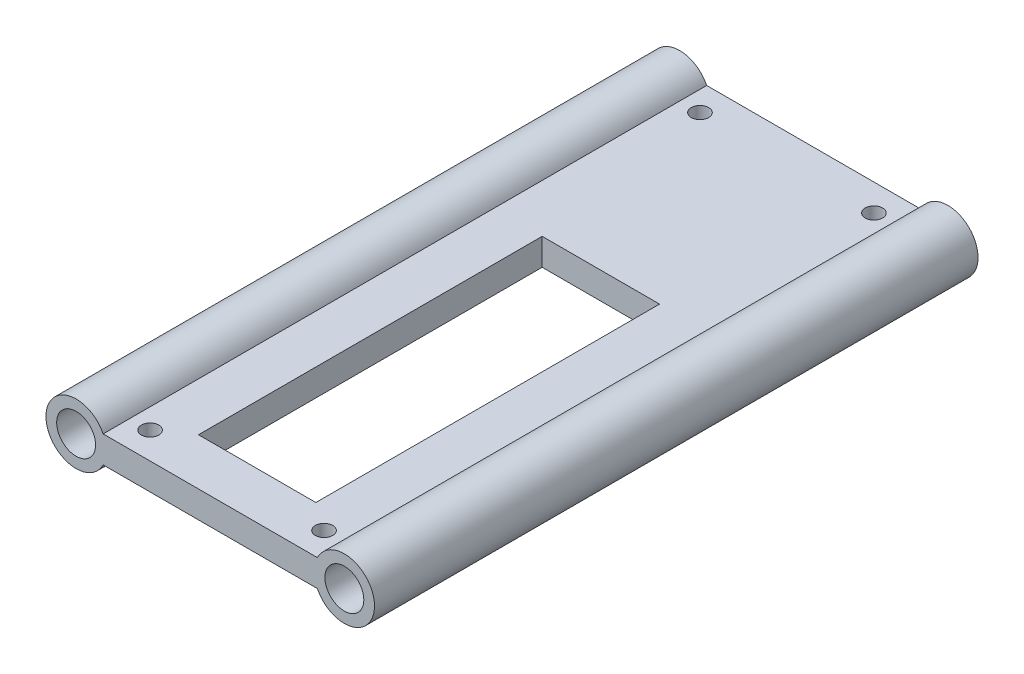
ISO-10303-21;
HEADER;
FILE_DESCRIPTION(('STEP AP214'),'2;1');
FILE_NAME('part.step','',(''),(''),'','','');
FILE_SCHEMA(('AUTOMOTIVE_DESIGN { 1 0 10303 214 1 1 1 1 }'));
ENDSEC;
DATA;
#1=APPLICATION_CONTEXT('core data for automotive mechanical design processes');
#2=APPLICATION_PROTOCOL_DEFINITION('international standard','automotive_design',2000,#1);
#3=PRODUCT_CONTEXT('',#1,'mechanical');
#4=PRODUCT('Part','Part','',(#3));
#5=PRODUCT_RELATED_PRODUCT_CATEGORY('part','',(#4));
#6=PRODUCT_DEFINITION_FORMATION('','',#4);
#7=PRODUCT_DEFINITION_CONTEXT('part definition',#1,'design');
#8=PRODUCT_DEFINITION('design','',#6,#7);
#9=PRODUCT_DEFINITION_SHAPE('','',#8);
#10=(LENGTH_UNIT() NAMED_UNIT(*) SI_UNIT(.MILLI.,.METRE.));
#11=(NAMED_UNIT(*) PLANE_ANGLE_UNIT() SI_UNIT($,.RADIAN.));
#12=(NAMED_UNIT(*) SI_UNIT($,.STERADIAN.) SOLID_ANGLE_UNIT());
#13=UNCERTAINTY_MEASURE_WITH_UNIT(LENGTH_MEASURE(1.E-05),#10,'distance_accuracy_value','');
#14=(GEOMETRIC_REPRESENTATION_CONTEXT(3) GLOBAL_UNCERTAINTY_ASSIGNED_CONTEXT((#13)) GLOBAL_UNIT_ASSIGNED_CONTEXT((#10,
#11,#12)) REPRESENTATION_CONTEXT('',''));
#15=CARTESIAN_POINT('',(0.,0.,0.));
#16=DIRECTION('',(0.,0.,1.));
#17=DIRECTION('',(1.,0.,0.));
#18=AXIS2_PLACEMENT_3D('',#15,#16,#17);
#19=CARTESIAN_POINT('',(0.,-2.54,-114.3));
#20=DIRECTION('',(0.,-1.,0.));
#21=DIRECTION('',(0.,0.,-1.));
#22=AXIS2_PLACEMENT_3D('',#19,#20,#21);
#23=PLANE('',#22);
#24=CARTESIAN_POINT('',(16.4704663298304,-2.54,-109.22));
#25=DIRECTION('',(0.,-1.,0.));
#26=DIRECTION('',(0.,0.,-1.));
#27=AXIS2_PLACEMENT_3D('',#24,#25,#26);
#28=CIRCLE('',#27,1.651);
#29=CARTESIAN_POINT('',(16.4704663298304,-2.54,-110.871));
#30=VERTEX_POINT('',#29);
#31=EDGE_CURVE('E182',#30,#30,#28,.T.);
#32=ORIENTED_EDGE('',*,*,#31,.F.);
#33=EDGE_LOOP('',(#32));
#34=FACE_BOUND('',#33,.T.);
#35=CARTESIAN_POINT('',(-16.4704663298304,-2.54,-5.08));
#36=DIRECTION('',(0.,-1.,0.));
#37=DIRECTION('',(0.,0.,-1.));
#38=AXIS2_PLACEMENT_3D('',#35,#36,#37);
#39=CIRCLE('',#38,1.651);
#40=CARTESIAN_POINT('',(-16.4704663298304,-2.54,-6.731));
#41=VERTEX_POINT('',#40);
#42=EDGE_CURVE('E179',#41,#41,#39,.T.);
#43=ORIENTED_EDGE('',*,*,#42,.F.);
#44=EDGE_LOOP('',(#43));
#45=FACE_BOUND('',#44,.T.);
#46=CARTESIAN_POINT('',(16.4704663298304,-2.54,-5.08));
#47=DIRECTION('',(0.,-1.,0.));
#48=DIRECTION('',(0.,0.,-1.));
#49=AXIS2_PLACEMENT_3D('',#46,#47,#48);
#50=CIRCLE('',#49,1.651);
#51=CARTESIAN_POINT('',(16.4704663298304,-2.54,-6.731));
#52=VERTEX_POINT('',#51);
#53=EDGE_CURVE('E176',#52,#52,#50,.T.);
#54=ORIENTED_EDGE('',*,*,#53,.F.);
#55=EDGE_LOOP('',(#54));
#56=FACE_BOUND('',#55,.T.);
#57=DIRECTION('',(0.,0.,1.));
#58=VECTOR('',#57,1.);
#59=CARTESIAN_POINT('',(11.1125,-2.54,-114.3));
#60=LINE('',#59,#58);
#61=CARTESIAN_POINT('',(11.1125,-2.54,-73.9775));
#62=VERTEX_POINT('',#61);
#63=CARTESIAN_POINT('',(11.1125,-2.54,-8.88999999999999));
#64=VERTEX_POINT('',#63);
#65=EDGE_CURVE('E131',#62,#64,#60,.T.);
#66=ORIENTED_EDGE('',*,*,#65,.F.);
#67=DIRECTION('',(1.,0.,0.));
#68=VECTOR('',#67,1.);
#69=CARTESIAN_POINT('',(0.,-2.54,-73.9775));
#70=LINE('',#69,#68);
#71=CARTESIAN_POINT('',(-11.1125,-2.54,-73.9775));
#72=VERTEX_POINT('',#71);
#73=EDGE_CURVE('E169',#72,#62,#70,.T.);
#74=ORIENTED_EDGE('',*,*,#73,.F.);
#75=DIRECTION('',(0.,0.,-1.));
#76=VECTOR('',#75,1.);
#77=CARTESIAN_POINT('',(-11.1125,-2.54,-114.3));
#78=LINE('',#77,#76);
#79=CARTESIAN_POINT('',(-11.1125,-2.54,-8.89));
#80=VERTEX_POINT('',#79);
#81=EDGE_CURVE('E171',#80,#72,#78,.T.);
#82=ORIENTED_EDGE('',*,*,#81,.F.);
#83=DIRECTION('',(-1.,0.,0.));
#84=VECTOR('',#83,1.);
#85=CARTESIAN_POINT('',(0.,-2.54,-8.89));
#86=LINE('',#85,#84);
#87=EDGE_CURVE('E173',#64,#80,#86,.T.);
#88=ORIENTED_EDGE('',*,*,#87,.F.);
#89=EDGE_LOOP('',(#66,#74,#82,#88));
#90=FACE_BOUND('',#89,.T.);
#91=CARTESIAN_POINT('',(-16.4704663298304,-2.54,-109.22));
#92=DIRECTION('',(0.,-1.,0.));
#93=DIRECTION('',(0.,0.,-1.));
#94=AXIS2_PLACEMENT_3D('',#91,#92,#93);
#95=CIRCLE('',#94,1.651);
#96=CARTESIAN_POINT('',(-16.4704663298304,-2.54,-110.871));
#97=VERTEX_POINT('',#96);
#98=EDGE_CURVE('E166',#97,#97,#95,.T.);
#99=ORIENTED_EDGE('',*,*,#98,.F.);
#100=EDGE_LOOP('',(#99));
#101=FACE_BOUND('',#100,.T.);
#102=DIRECTION('',(1.,0.,0.));
#103=VECTOR('',#102,1.);
#104=CARTESIAN_POINT('',(0.,-2.54,0.));
#105=LINE('',#104,#103);
#106=CARTESIAN_POINT('',(-20.2804663298304,-2.54,0.));
#107=VERTEX_POINT('',#106);
#108=CARTESIAN_POINT('',(20.2804663298304,-2.54,0.));
#109=VERTEX_POINT('',#108);
#110=EDGE_CURVE('E202',#107,#109,#105,.T.);
#111=ORIENTED_EDGE('',*,*,#110,.F.);
#112=DIRECTION('',(0.,0.,1.));
#113=VECTOR('',#112,1.);
#114=CARTESIAN_POINT('',(-20.2804663298304,-2.54,-114.3));
#115=LINE('',#114,#113);
#116=CARTESIAN_POINT('',(-20.2804663298304,-2.54,-114.3));
#117=VERTEX_POINT('',#116);
#118=EDGE_CURVE('E12',#117,#107,#115,.T.);
#119=ORIENTED_EDGE('',*,*,#118,.F.);
#120=DIRECTION('',(1.,0.,0.));
#121=VECTOR('',#120,1.);
#122=CARTESIAN_POINT('',(0.,-2.54,-114.3));
#123=LINE('',#122,#121);
#124=CARTESIAN_POINT('',(20.2804663298304,-2.54,-114.3));
#125=VERTEX_POINT('',#124);
#126=EDGE_CURVE('E189',#117,#125,#123,.T.);
#127=ORIENTED_EDGE('',*,*,#126,.T.);
#128=DIRECTION('',(0.,0.,1.));
#129=VECTOR('',#128,1.);
#130=CARTESIAN_POINT('',(20.2804663298304,-2.54,-114.3));
#131=LINE('',#130,#129);
#132=EDGE_CURVE('E198',#125,#109,#131,.T.);
#133=ORIENTED_EDGE('',*,*,#132,.T.);
#134=EDGE_LOOP('',(#111,#119,#127,#133));
#135=FACE_BOUND('',#134,.T.);
#136=ADVANCED_FACE('F62',(#34,#45,#56,#90,#101,#135),#23,.T.);
#137=CARTESIAN_POINT('',(0.,2.54,-114.3));
#138=DIRECTION('',(0.,-1.,0.));
#139=DIRECTION('',(0.,0.,-1.));
#140=AXIS2_PLACEMENT_3D('',#137,#138,#139);
#141=PLANE('',#140);
#142=CARTESIAN_POINT('',(16.4704663298304,2.54,-109.22));
#143=DIRECTION('',(0.,1.,0.));
#144=DIRECTION('',(0.,0.,1.));
#145=AXIS2_PLACEMENT_3D('',#142,#143,#144);
#146=CIRCLE('',#145,1.651);
#147=CARTESIAN_POINT('',(16.4704663298304,2.54,-107.569));
#148=VERTEX_POINT('',#147);
#149=EDGE_CURVE('E158',#148,#148,#146,.T.);
#150=ORIENTED_EDGE('',*,*,#149,.F.);
#151=EDGE_LOOP('',(#150));
#152=FACE_BOUND('',#151,.T.);
#153=CARTESIAN_POINT('',(-16.4704663298304,2.54,-5.08));
#154=DIRECTION('',(0.,1.,0.));
#155=DIRECTION('',(0.,0.,1.));
#156=AXIS2_PLACEMENT_3D('',#153,#154,#155);
#157=CIRCLE('',#156,1.651);
#158=CARTESIAN_POINT('',(-16.4704663298304,2.54,-3.429));
#159=VERTEX_POINT('',#158);
#160=EDGE_CURVE('E153',#159,#159,#157,.T.);
#161=ORIENTED_EDGE('',*,*,#160,.F.);
#162=EDGE_LOOP('',(#161));
#163=FACE_BOUND('',#162,.T.);
#164=CARTESIAN_POINT('',(16.4704663298304,2.54,-5.08));
#165=DIRECTION('',(0.,1.,0.));
#166=DIRECTION('',(0.,0.,1.));
#167=AXIS2_PLACEMENT_3D('',#164,#165,#166);
#168=CIRCLE('',#167,1.651);
#169=CARTESIAN_POINT('',(16.4704663298304,2.54,-3.429));
#170=VERTEX_POINT('',#169);
#171=EDGE_CURVE('E150',#170,#170,#168,.T.);
#172=ORIENTED_EDGE('',*,*,#171,.F.);
#173=EDGE_LOOP('',(#172));
#174=FACE_BOUND('',#173,.T.);
#175=DIRECTION('',(-1.,0.,0.));
#176=VECTOR('',#175,1.);
#177=CARTESIAN_POINT('',(-11.1125,2.54,-73.9775));
#178=LINE('',#177,#176);
#179=CARTESIAN_POINT('',(11.1125,2.54,-73.9775));
#180=VERTEX_POINT('',#179);
#181=CARTESIAN_POINT('',(-11.1125,2.54,-73.9775));
#182=VERTEX_POINT('',#181);
#183=EDGE_CURVE('E149',#180,#182,#178,.T.);
#184=ORIENTED_EDGE('',*,*,#183,.F.);
#185=DIRECTION('',(0.,0.,-1.));
#186=VECTOR('',#185,1.);
#187=CARTESIAN_POINT('',(11.1125,2.54,-73.9775));
#188=LINE('',#187,#186);
#189=CARTESIAN_POINT('',(11.1125,2.54,-8.88999999999999));
#190=VERTEX_POINT('',#189);
#191=EDGE_CURVE('E87',#190,#180,#188,.T.);
#192=ORIENTED_EDGE('',*,*,#191,.F.);
#193=DIRECTION('',(1.,0.,0.));
#194=VECTOR('',#193,1.);
#195=CARTESIAN_POINT('',(-11.1125,2.54,-8.89));
#196=LINE('',#195,#194);
#197=CARTESIAN_POINT('',(-11.1125,2.54,-8.89));
#198=VERTEX_POINT('',#197);
#199=EDGE_CURVE('E137',#198,#190,#196,.T.);
#200=ORIENTED_EDGE('',*,*,#199,.F.);
#201=DIRECTION('',(0.,0.,1.));
#202=VECTOR('',#201,1.);
#203=CARTESIAN_POINT('',(-11.1125,2.54,-73.9775));
#204=LINE('',#203,#202);
#205=EDGE_CURVE('E143',#182,#198,#204,.T.);
#206=ORIENTED_EDGE('',*,*,#205,.F.);
#207=EDGE_LOOP('',(#184,#192,#200,#206));
#208=FACE_BOUND('',#207,.T.);
#209=CARTESIAN_POINT('',(-16.4704663298304,2.54,-109.22));
#210=DIRECTION('',(0.,1.,0.));
#211=DIRECTION('',(0.,0.,1.));
#212=AXIS2_PLACEMENT_3D('',#209,#210,#211);
#213=CIRCLE('',#212,1.651);
#214=CARTESIAN_POINT('',(-16.4704663298304,2.54,-107.569));
#215=VERTEX_POINT('',#214);
#216=EDGE_CURVE('E161',#215,#215,#213,.T.);
#217=ORIENTED_EDGE('',*,*,#216,.F.);
#218=EDGE_LOOP('',(#217));
#219=FACE_BOUND('',#218,.T.);
#220=DIRECTION('',(1.,0.,0.));
#221=VECTOR('',#220,1.);
#222=CARTESIAN_POINT('',(0.,2.54,0.));
#223=LINE('',#222,#221);
#224=CARTESIAN_POINT('',(-20.2804663298304,2.54,0.));
#225=VERTEX_POINT('',#224);
#226=CARTESIAN_POINT('',(20.2804663298304,2.54,0.));
#227=VERTEX_POINT('',#226);
#228=EDGE_CURVE('E190',#225,#227,#223,.T.);
#229=ORIENTED_EDGE('',*,*,#228,.T.);
#230=DIRECTION('',(0.,0.,1.));
#231=VECTOR('',#230,1.);
#232=CARTESIAN_POINT('',(20.2804663298304,2.54,-114.3));
#233=LINE('',#232,#231);
#234=CARTESIAN_POINT('',(20.2804663298304,2.54,-114.3));
#235=VERTEX_POINT('',#234);
#236=EDGE_CURVE('E212',#235,#227,#233,.T.);
#237=ORIENTED_EDGE('',*,*,#236,.F.);
#238=DIRECTION('',(1.,0.,0.));
#239=VECTOR('',#238,1.);
#240=CARTESIAN_POINT('',(0.,2.54,-114.3));
#241=LINE('',#240,#239);
#242=CARTESIAN_POINT('',(-20.2804663298304,2.54,-114.3));
#243=VERTEX_POINT('',#242);
#244=EDGE_CURVE('E196',#243,#235,#241,.T.);
#245=ORIENTED_EDGE('',*,*,#244,.F.);
#246=DIRECTION('',(0.,0.,1.));
#247=VECTOR('',#246,1.);
#248=CARTESIAN_POINT('',(-20.2804663298304,2.54,-114.3));
#249=LINE('',#248,#247);
#250=EDGE_CURVE('E71',#243,#225,#249,.T.);
#251=ORIENTED_EDGE('',*,*,#250,.T.);
#252=EDGE_LOOP('',(#229,#237,#245,#251));
#253=FACE_BOUND('',#252,.T.);
#254=ADVANCED_FACE('F147',(#152,#163,#174,#208,#219,#253),#141,.F.);
#255=CARTESIAN_POINT('',(25.4,0.,-114.3));
#256=DIRECTION('',(0.,0.,1.));
#257=DIRECTION('',(1.,0.,0.));
#258=AXIS2_PLACEMENT_3D('',#255,#256,#257);
#259=CYLINDRICAL_SURFACE('',#258,3.683);
#260=CARTESIAN_POINT('',(25.4,0.,-114.3));
#261=DIRECTION('',(0.,0.,1.));
#262=DIRECTION('',(1.,0.,0.));
#263=AXIS2_PLACEMENT_3D('',#260,#261,#262);
#264=CIRCLE('',#263,3.683);
#265=CARTESIAN_POINT('',(29.083,0.,-114.3));
#266=VERTEX_POINT('',#265);
#267=EDGE_CURVE('E186',#266,#266,#264,.T.);
#268=ORIENTED_EDGE('',*,*,#267,.F.);
#269=EDGE_LOOP('',(#268));
#270=FACE_BOUND('',#269,.T.);
#271=CARTESIAN_POINT('',(25.4,0.,0.));
#272=DIRECTION('',(0.,0.,1.));
#273=DIRECTION('',(1.,0.,0.));
#274=AXIS2_PLACEMENT_3D('',#271,#272,#273);
#275=CIRCLE('',#274,3.683);
#276=CARTESIAN_POINT('',(29.083,0.,0.));
#277=VERTEX_POINT('',#276);
#278=EDGE_CURVE('E199',#277,#277,#275,.T.);
#279=ORIENTED_EDGE('',*,*,#278,.T.);
#280=EDGE_LOOP('',(#279));
#281=FACE_BOUND('',#280,.T.);
#282=ADVANCED_FACE('F295',(#270,#281),#259,.F.);
#283=CARTESIAN_POINT('',(25.4,0.,-114.3));
#284=DIRECTION('',(0.,0.,1.));
#285=DIRECTION('',(1.,0.,0.));
#286=AXIS2_PLACEMENT_3D('',#283,#284,#285);
#287=CYLINDRICAL_SURFACE('',#286,5.715);
#288=CARTESIAN_POINT('',(25.4,0.,0.));
#289=DIRECTION('',(0.,0.,1.));
#290=DIRECTION('',(1.,0.,0.));
#291=AXIS2_PLACEMENT_3D('',#288,#289,#290);
#292=CIRCLE('',#291,5.715);
#293=EDGE_CURVE('E206',#109,#227,#292,.T.);
#294=ORIENTED_EDGE('',*,*,#293,.F.);
#295=ORIENTED_EDGE('',*,*,#132,.F.);
#296=CARTESIAN_POINT('',(25.4,0.,-114.3));
#297=DIRECTION('',(0.,0.,1.));
#298=DIRECTION('',(1.,0.,0.));
#299=AXIS2_PLACEMENT_3D('',#296,#297,#298);
#300=CIRCLE('',#299,5.715);
#301=EDGE_CURVE('E193',#125,#235,#300,.T.);
#302=ORIENTED_EDGE('',*,*,#301,.T.);
#303=ORIENTED_EDGE('',*,*,#236,.T.);
#304=EDGE_LOOP('',(#294,#295,#302,#303));
#305=FACE_BOUND('',#304,.T.);
#306=ADVANCED_FACE('F234',(#305),#287,.T.);
#307=CARTESIAN_POINT('',(0.,0.,-114.3));
#308=DIRECTION('',(0.,0.,1.));
#309=DIRECTION('',(1.,0.,0.));
#310=AXIS2_PLACEMENT_3D('',#307,#308,#309);
#311=PLANE('',#310);
#312=ORIENTED_EDGE('',*,*,#267,.T.);
#313=EDGE_LOOP('',(#312));
#314=FACE_BOUND('',#313,.T.);
#315=ORIENTED_EDGE('',*,*,#126,.F.);
#316=CARTESIAN_POINT('',(-25.4,0.,-114.3));
#317=DIRECTION('',(0.,0.,1.));
#318=DIRECTION('',(1.,0.,0.));
#319=AXIS2_PLACEMENT_3D('',#316,#317,#318);
#320=CIRCLE('',#319,5.715);
#321=EDGE_CURVE('E203',#243,#117,#320,.T.);
#322=ORIENTED_EDGE('',*,*,#321,.F.);
#323=ORIENTED_EDGE('',*,*,#244,.T.);
#324=ORIENTED_EDGE('',*,*,#301,.F.);
#325=EDGE_LOOP('',(#315,#322,#323,#324));
#326=FACE_BOUND('',#325,.T.);
#327=CARTESIAN_POINT('',(-25.4,0.,-114.3));
#328=DIRECTION('',(0.,0.,1.));
#329=DIRECTION('',(1.,0.,0.));
#330=AXIS2_PLACEMENT_3D('',#327,#328,#329);
#331=CIRCLE('',#330,3.683);
#332=CARTESIAN_POINT('',(-21.717,0.,-114.3));
#333=VERTEX_POINT('',#332);
#334=EDGE_CURVE('E215',#333,#333,#331,.T.);
#335=ORIENTED_EDGE('',*,*,#334,.T.);
#336=EDGE_LOOP('',(#335));
#337=FACE_BOUND('',#336,.T.);
#338=ADVANCED_FACE('F239',(#314,#326,#337),#311,.F.);
#339=CARTESIAN_POINT('',(0.,0.,0.));
#340=DIRECTION('',(0.,0.,1.));
#341=DIRECTION('',(1.,0.,0.));
#342=AXIS2_PLACEMENT_3D('',#339,#340,#341);
#343=PLANE('',#342);
#344=ORIENTED_EDGE('',*,*,#278,.F.);
#345=EDGE_LOOP('',(#344));
#346=FACE_BOUND('',#345,.T.);
#347=ORIENTED_EDGE('',*,*,#110,.T.);
#348=ORIENTED_EDGE('',*,*,#293,.T.);
#349=ORIENTED_EDGE('',*,*,#228,.F.);
#350=CARTESIAN_POINT('',(-25.4,0.,0.));
#351=DIRECTION('',(0.,0.,1.));
#352=DIRECTION('',(1.,0.,0.));
#353=AXIS2_PLACEMENT_3D('',#350,#351,#352);
#354=CIRCLE('',#353,5.715);
#355=EDGE_CURVE('E66',#225,#107,#354,.T.);
#356=ORIENTED_EDGE('',*,*,#355,.T.);
#357=EDGE_LOOP('',(#347,#348,#349,#356));
#358=FACE_BOUND('',#357,.T.);
#359=CARTESIAN_POINT('',(-25.4,0.,0.));
#360=DIRECTION('',(0.,0.,1.));
#361=DIRECTION('',(1.,0.,0.));
#362=AXIS2_PLACEMENT_3D('',#359,#360,#361);
#363=CIRCLE('',#362,3.683);
#364=CARTESIAN_POINT('',(-21.717,0.,0.));
#365=VERTEX_POINT('',#364);
#366=EDGE_CURVE('E185',#365,#365,#363,.T.);
#367=ORIENTED_EDGE('',*,*,#366,.F.);
#368=EDGE_LOOP('',(#367));
#369=FACE_BOUND('',#368,.T.);
#370=ADVANCED_FACE('F228',(#346,#358,#369),#343,.T.);
#371=CARTESIAN_POINT('',(-25.4,0.,-114.3));
#372=DIRECTION('',(0.,0.,1.));
#373=DIRECTION('',(1.,0.,0.));
#374=AXIS2_PLACEMENT_3D('',#371,#372,#373);
#375=CYLINDRICAL_SURFACE('',#374,5.715);
#376=ORIENTED_EDGE('',*,*,#321,.T.);
#377=ORIENTED_EDGE('',*,*,#118,.T.);
#378=ORIENTED_EDGE('',*,*,#355,.F.);
#379=ORIENTED_EDGE('',*,*,#250,.F.);
#380=EDGE_LOOP('',(#376,#377,#378,#379));
#381=FACE_BOUND('',#380,.T.);
#382=ADVANCED_FACE('F64',(#381),#375,.T.);
#383=CARTESIAN_POINT('',(-25.4,0.,-114.3));
#384=DIRECTION('',(0.,0.,1.));
#385=DIRECTION('',(1.,0.,0.));
#386=AXIS2_PLACEMENT_3D('',#383,#384,#385);
#387=CYLINDRICAL_SURFACE('',#386,3.683);
#388=ORIENTED_EDGE('',*,*,#334,.F.);
#389=EDGE_LOOP('',(#388));
#390=FACE_BOUND('',#389,.T.);
#391=ORIENTED_EDGE('',*,*,#366,.T.);
#392=EDGE_LOOP('',(#391));
#393=FACE_BOUND('',#392,.T.);
#394=ADVANCED_FACE('F246',(#390,#393),#387,.F.);
#395=CARTESIAN_POINT('',(-16.4704663298304,-111.76,-109.22));
#396=DIRECTION('',(0.,1.,0.));
#397=DIRECTION('',(0.,0.,1.));
#398=AXIS2_PLACEMENT_3D('',#395,#396,#397);
#399=CYLINDRICAL_SURFACE('',#398,1.651);
#400=ORIENTED_EDGE('',*,*,#98,.T.);
#401=EDGE_LOOP('',(#400));
#402=FACE_BOUND('',#401,.T.);
#403=ORIENTED_EDGE('',*,*,#216,.T.);
#404=EDGE_LOOP('',(#403));
#405=FACE_BOUND('',#404,.T.);
#406=ADVANCED_FACE('F249',(#402,#405),#399,.F.);
#407=CARTESIAN_POINT('',(11.1125,-111.76,-73.9775));
#408=DIRECTION('',(1.,0.,0.));
#409=DIRECTION('',(0.,0.,-1.));
#410=AXIS2_PLACEMENT_3D('',#407,#408,#409);
#411=PLANE('',#410);
#412=ORIENTED_EDGE('',*,*,#65,.T.);
#413=DIRECTION('',(0.,1.,0.));
#414=VECTOR('',#413,1.);
#415=CARTESIAN_POINT('',(11.1125,-111.76,-8.88999999999999));
#416=LINE('',#415,#414);
#417=EDGE_CURVE('E127',#64,#190,#416,.T.);
#418=ORIENTED_EDGE('',*,*,#417,.T.);
#419=ORIENTED_EDGE('',*,*,#191,.T.);
#420=DIRECTION('',(0.,1.,0.));
#421=VECTOR('',#420,1.);
#422=CARTESIAN_POINT('',(11.1125,-111.76,-73.9775));
#423=LINE('',#422,#421);
#424=EDGE_CURVE('E144',#62,#180,#423,.T.);
#425=ORIENTED_EDGE('',*,*,#424,.F.);
#426=EDGE_LOOP('',(#412,#418,#419,#425));
#427=FACE_BOUND('',#426,.T.);
#428=ADVANCED_FACE('F129',(#427),#411,.F.);
#429=CARTESIAN_POINT('',(-11.1125,-111.76,-8.89));
#430=DIRECTION('',(0.,0.,1.));
#431=DIRECTION('',(1.,0.,0.));
#432=AXIS2_PLACEMENT_3D('',#429,#430,#431);
#433=PLANE('',#432);
#434=ORIENTED_EDGE('',*,*,#87,.T.);
#435=DIRECTION('',(0.,1.,0.));
#436=VECTOR('',#435,1.);
#437=CARTESIAN_POINT('',(-11.1125,-111.76,-8.89));
#438=LINE('',#437,#436);
#439=EDGE_CURVE('E134',#80,#198,#438,.T.);
#440=ORIENTED_EDGE('',*,*,#439,.T.);
#441=ORIENTED_EDGE('',*,*,#199,.T.);
#442=ORIENTED_EDGE('',*,*,#417,.F.);
#443=EDGE_LOOP('',(#434,#440,#441,#442));
#444=FACE_BOUND('',#443,.T.);
#445=ADVANCED_FACE('F138',(#444),#433,.F.);
#446=CARTESIAN_POINT('',(-11.1125,-111.76,-73.9775));
#447=DIRECTION('',(-1.,0.,0.));
#448=DIRECTION('',(0.,0.,1.));
#449=AXIS2_PLACEMENT_3D('',#446,#447,#448);
#450=PLANE('',#449);
#451=ORIENTED_EDGE('',*,*,#81,.T.);
#452=DIRECTION('',(0.,1.,0.));
#453=VECTOR('',#452,1.);
#454=CARTESIAN_POINT('',(-11.1125,-111.76,-73.9775));
#455=LINE('',#454,#453);
#456=EDGE_CURVE('E79',#72,#182,#455,.T.);
#457=ORIENTED_EDGE('',*,*,#456,.T.);
#458=ORIENTED_EDGE('',*,*,#205,.T.);
#459=ORIENTED_EDGE('',*,*,#439,.F.);
#460=EDGE_LOOP('',(#451,#457,#458,#459));
#461=FACE_BOUND('',#460,.T.);
#462=ADVANCED_FACE('F280',(#461),#450,.F.);
#463=CARTESIAN_POINT('',(-11.1125,-111.76,-73.9775));
#464=DIRECTION('',(0.,0.,-1.));
#465=DIRECTION('',(-1.,0.,0.));
#466=AXIS2_PLACEMENT_3D('',#463,#464,#465);
#467=PLANE('',#466);
#468=ORIENTED_EDGE('',*,*,#73,.T.);
#469=ORIENTED_EDGE('',*,*,#424,.T.);
#470=ORIENTED_EDGE('',*,*,#183,.T.);
#471=ORIENTED_EDGE('',*,*,#456,.F.);
#472=EDGE_LOOP('',(#468,#469,#470,#471));
#473=FACE_BOUND('',#472,.T.);
#474=ADVANCED_FACE('F283',(#473),#467,.F.);
#475=CARTESIAN_POINT('',(16.4704663298304,-111.76,-5.08));
#476=DIRECTION('',(0.,1.,0.));
#477=DIRECTION('',(0.,0.,1.));
#478=AXIS2_PLACEMENT_3D('',#475,#476,#477);
#479=CYLINDRICAL_SURFACE('',#478,1.651);
#480=ORIENTED_EDGE('',*,*,#53,.T.);
#481=EDGE_LOOP('',(#480));
#482=FACE_BOUND('',#481,.T.);
#483=ORIENTED_EDGE('',*,*,#171,.T.);
#484=EDGE_LOOP('',(#483));
#485=FACE_BOUND('',#484,.T.);
#486=ADVANCED_FACE('F273',(#482,#485),#479,.F.);
#487=CARTESIAN_POINT('',(-16.4704663298304,-111.76,-5.08));
#488=DIRECTION('',(0.,1.,0.));
#489=DIRECTION('',(0.,0.,1.));
#490=AXIS2_PLACEMENT_3D('',#487,#488,#489);
#491=CYLINDRICAL_SURFACE('',#490,1.651);
#492=ORIENTED_EDGE('',*,*,#42,.T.);
#493=EDGE_LOOP('',(#492));
#494=FACE_BOUND('',#493,.T.);
#495=ORIENTED_EDGE('',*,*,#160,.T.);
#496=EDGE_LOOP('',(#495));
#497=FACE_BOUND('',#496,.T.);
#498=ADVANCED_FACE('F269',(#494,#497),#491,.F.);
#499=CARTESIAN_POINT('',(16.4704663298304,-111.76,-109.22));
#500=DIRECTION('',(0.,1.,0.));
#501=DIRECTION('',(0.,0.,1.));
#502=AXIS2_PLACEMENT_3D('',#499,#500,#501);
#503=CYLINDRICAL_SURFACE('',#502,1.651);
#504=ORIENTED_EDGE('',*,*,#31,.T.);
#505=EDGE_LOOP('',(#504));
#506=FACE_BOUND('',#505,.T.);
#507=ORIENTED_EDGE('',*,*,#149,.T.);
#508=EDGE_LOOP('',(#507));
#509=FACE_BOUND('',#508,.T.);
#510=ADVANCED_FACE('F272',(#506,#509),#503,.F.);
#511=CLOSED_SHELL('',(#136,#254,#282,#306,#338,#370,#382,#394,#406,#428,#445,#462,#474,#486,
#498,#510));
#512=MANIFOLD_SOLID_BREP('B2',#511);
#513=ADVANCED_BREP_SHAPE_REPRESENTATION('',(#18,#512),#14);
#514=SHAPE_DEFINITION_REPRESENTATION(#9,#513);
ENDSEC;
END-ISO-10303-21;
